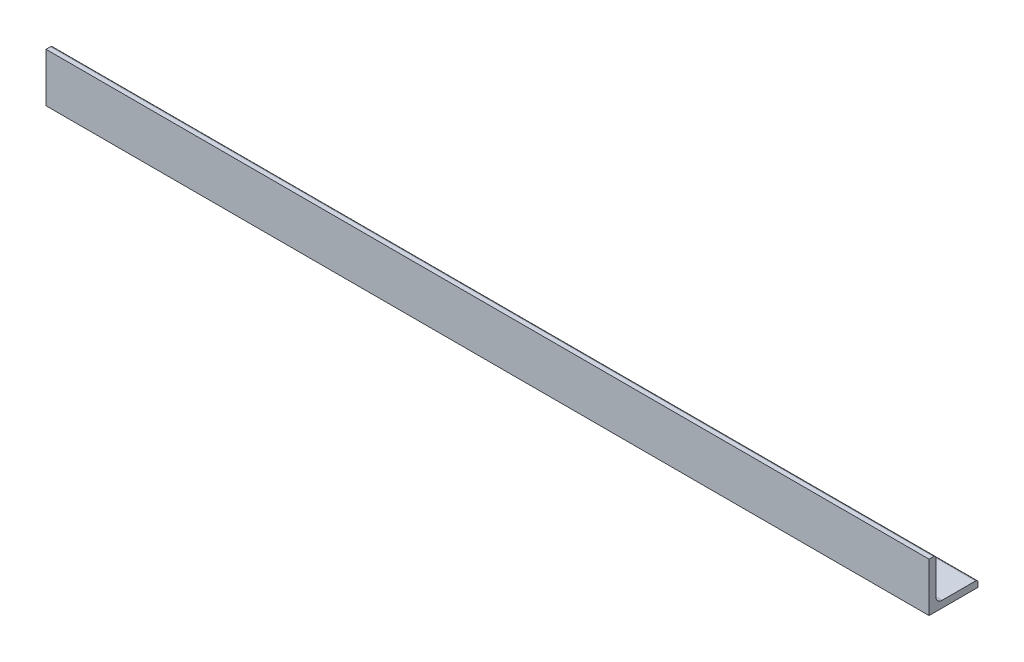
ISO-10303-21;
HEADER;
FILE_DESCRIPTION(('STEP AP214'),'2;1');
FILE_NAME('part.step','',(''),(''),'','','');
FILE_SCHEMA(('AUTOMOTIVE_DESIGN { 1 0 10303 214 1 1 1 1 }'));
ENDSEC;
DATA;
#1=APPLICATION_CONTEXT('core data for automotive mechanical design processes');
#2=APPLICATION_PROTOCOL_DEFINITION('international standard','automotive_design',2000,#1);
#3=PRODUCT_CONTEXT('',#1,'mechanical');
#4=PRODUCT('Part','Part','',(#3));
#5=PRODUCT_RELATED_PRODUCT_CATEGORY('part','',(#4));
#6=PRODUCT_DEFINITION_FORMATION('','',#4);
#7=PRODUCT_DEFINITION_CONTEXT('part definition',#1,'design');
#8=PRODUCT_DEFINITION('design','',#6,#7);
#9=PRODUCT_DEFINITION_SHAPE('','',#8);
#10=(LENGTH_UNIT() NAMED_UNIT(*) SI_UNIT(.MILLI.,.METRE.));
#11=(NAMED_UNIT(*) PLANE_ANGLE_UNIT() SI_UNIT($,.RADIAN.));
#12=(NAMED_UNIT(*) SI_UNIT($,.STERADIAN.) SOLID_ANGLE_UNIT());
#13=UNCERTAINTY_MEASURE_WITH_UNIT(LENGTH_MEASURE(1.E-05),#10,'distance_accuracy_value','');
#14=(GEOMETRIC_REPRESENTATION_CONTEXT(3) GLOBAL_UNCERTAINTY_ASSIGNED_CONTEXT((#13)) GLOBAL_UNIT_ASSIGNED_CONTEXT((#10,
#11,#12)) REPRESENTATION_CONTEXT('',''));
#15=CARTESIAN_POINT('',(0.,0.,0.));
#16=DIRECTION('',(0.,0.,1.));
#17=DIRECTION('',(1.,0.,0.));
#18=AXIS2_PLACEMENT_3D('',#15,#16,#17);
#19=CARTESIAN_POINT('',(650.,36.,0.));
#20=DIRECTION('',(0.,-1.,0.));
#21=DIRECTION('',(0.,0.,-1.));
#22=AXIS2_PLACEMENT_3D('',#19,#20,#21);
#23=PLANE('',#22);
#24=DIRECTION('',(0.,0.,1.));
#25=VECTOR('',#24,1.);
#26=CARTESIAN_POINT('',(0.,36.,0.));
#27=LINE('',#26,#25);
#28=CARTESIAN_POINT('',(0.,36.,-3.33333333333333));
#29=VERTEX_POINT('',#28);
#30=CARTESIAN_POINT('',(0.,36.,0.));
#31=VERTEX_POINT('',#30);
#32=EDGE_CURVE('E176',#29,#31,#27,.T.);
#33=ORIENTED_EDGE('',*,*,#32,.T.);
#34=DIRECTION('',(-1.,0.,0.));
#35=VECTOR('',#34,1.);
#36=CARTESIAN_POINT('',(650.,36.,0.));
#37=LINE('',#36,#35);
#38=CARTESIAN_POINT('',(650.,36.,0.));
#39=VERTEX_POINT('',#38);
#40=EDGE_CURVE('E13',#39,#31,#37,.T.);
#41=ORIENTED_EDGE('',*,*,#40,.F.);
#42=DIRECTION('',(0.,0.,1.));
#43=VECTOR('',#42,1.);
#44=CARTESIAN_POINT('',(650.,36.,0.));
#45=LINE('',#44,#43);
#46=CARTESIAN_POINT('',(650.,36.,-3.33333333333333));
#47=VERTEX_POINT('',#46);
#48=EDGE_CURVE('E201',#47,#39,#45,.T.);
#49=ORIENTED_EDGE('',*,*,#48,.F.);
#50=DIRECTION('',(-1.,0.,0.));
#51=VECTOR('',#50,1.);
#52=CARTESIAN_POINT('',(650.,36.,-3.33333333333333));
#53=LINE('',#52,#51);
#54=EDGE_CURVE('E172',#47,#29,#53,.T.);
#55=ORIENTED_EDGE('',*,*,#54,.T.);
#56=EDGE_LOOP('',(#33,#41,#49,#55));
#57=FACE_BOUND('',#56,.T.);
#58=ADVANCED_FACE('F69',(#57),#23,.F.);
#59=CARTESIAN_POINT('',(650.,36.,0.));
#60=DIRECTION('',(0.,0.,-1.));
#61=DIRECTION('',(0.,1.,0.));
#62=AXIS2_PLACEMENT_3D('',#59,#60,#61);
#63=PLANE('',#62);
#64=DIRECTION('',(0.,-1.,0.));
#65=VECTOR('',#64,1.);
#66=CARTESIAN_POINT('',(0.,36.,0.));
#67=LINE('',#66,#65);
#68=CARTESIAN_POINT('',(0.,0.,0.));
#69=VERTEX_POINT('',#68);
#70=EDGE_CURVE('E180',#31,#69,#67,.T.);
#71=ORIENTED_EDGE('',*,*,#70,.T.);
#72=DIRECTION('',(-1.,0.,0.));
#73=VECTOR('',#72,1.);
#74=CARTESIAN_POINT('',(650.,0.,0.));
#75=LINE('',#74,#73);
#76=CARTESIAN_POINT('',(650.,0.,0.));
#77=VERTEX_POINT('',#76);
#78=EDGE_CURVE('E78',#77,#69,#75,.T.);
#79=ORIENTED_EDGE('',*,*,#78,.F.);
#80=DIRECTION('',(0.,-1.,0.));
#81=VECTOR('',#80,1.);
#82=CARTESIAN_POINT('',(650.,36.,0.));
#83=LINE('',#82,#81);
#84=EDGE_CURVE('E132',#39,#77,#83,.T.);
#85=ORIENTED_EDGE('',*,*,#84,.F.);
#86=ORIENTED_EDGE('',*,*,#40,.T.);
#87=EDGE_LOOP('',(#71,#79,#85,#86));
#88=FACE_BOUND('',#87,.T.);
#89=ADVANCED_FACE('F257',(#88),#63,.F.);
#90=CARTESIAN_POINT('',(650.,0.,0.));
#91=DIRECTION('',(0.,1.,0.));
#92=DIRECTION('',(0.,0.,1.));
#93=AXIS2_PLACEMENT_3D('',#90,#91,#92);
#94=PLANE('',#93);
#95=DIRECTION('',(0.,0.,-1.));
#96=VECTOR('',#95,1.);
#97=CARTESIAN_POINT('',(0.,0.,0.));
#98=LINE('',#97,#96);
#99=CARTESIAN_POINT('',(0.,0.,-36.));
#100=VERTEX_POINT('',#99);
#101=EDGE_CURVE('E183',#69,#100,#98,.T.);
#102=ORIENTED_EDGE('',*,*,#101,.T.);
#103=DIRECTION('',(-1.,0.,0.));
#104=VECTOR('',#103,1.);
#105=CARTESIAN_POINT('',(650.,0.,-36.));
#106=LINE('',#105,#104);
#107=CARTESIAN_POINT('',(650.,0.,-36.));
#108=VERTEX_POINT('',#107);
#109=EDGE_CURVE('E216',#108,#100,#106,.T.);
#110=ORIENTED_EDGE('',*,*,#109,.F.);
#111=DIRECTION('',(0.,0.,-1.));
#112=VECTOR('',#111,1.);
#113=CARTESIAN_POINT('',(650.,0.,0.));
#114=LINE('',#113,#112);
#115=EDGE_CURVE('E226',#77,#108,#114,.T.);
#116=ORIENTED_EDGE('',*,*,#115,.F.);
#117=ORIENTED_EDGE('',*,*,#78,.T.);
#118=EDGE_LOOP('',(#102,#110,#116,#117));
#119=FACE_BOUND('',#118,.T.);
#120=ADVANCED_FACE('F224',(#119),#94,.F.);
#121=CARTESIAN_POINT('',(650.,0.,-36.));
#122=DIRECTION('',(0.,0.,1.));
#123=DIRECTION('',(0.,-1.,0.));
#124=AXIS2_PLACEMENT_3D('',#121,#122,#123);
#125=PLANE('',#124);
#126=DIRECTION('',(0.,1.,0.));
#127=VECTOR('',#126,1.);
#128=CARTESIAN_POINT('',(0.,0.,-36.));
#129=LINE('',#128,#127);
#130=CARTESIAN_POINT('',(0.,3.33333333333334,-36.));
#131=VERTEX_POINT('',#130);
#132=EDGE_CURVE('E186',#100,#131,#129,.T.);
#133=ORIENTED_EDGE('',*,*,#132,.T.);
#134=DIRECTION('',(-1.,0.,0.));
#135=VECTOR('',#134,1.);
#136=CARTESIAN_POINT('',(650.,3.33333333333334,-36.));
#137=LINE('',#136,#135);
#138=CARTESIAN_POINT('',(650.,3.33333333333334,-36.));
#139=VERTEX_POINT('',#138);
#140=EDGE_CURVE('E212',#139,#131,#137,.T.);
#141=ORIENTED_EDGE('',*,*,#140,.F.);
#142=DIRECTION('',(0.,1.,0.));
#143=VECTOR('',#142,1.);
#144=CARTESIAN_POINT('',(650.,0.,-36.));
#145=LINE('',#144,#143);
#146=EDGE_CURVE('E243',#108,#139,#145,.T.);
#147=ORIENTED_EDGE('',*,*,#146,.F.);
#148=ORIENTED_EDGE('',*,*,#109,.T.);
#149=EDGE_LOOP('',(#133,#141,#147,#148));
#150=FACE_BOUND('',#149,.T.);
#151=ADVANCED_FACE('F235',(#150),#125,.F.);
#152=CARTESIAN_POINT('',(650.,3.33333333333334,-34.3333333333333));
#153=DIRECTION('',(-1.,0.,0.));
#154=DIRECTION('',(0.,0.,1.));
#155=AXIS2_PLACEMENT_3D('',#152,#153,#154);
#156=CYLINDRICAL_SURFACE('',#155,1.66666666666666);
#157=CARTESIAN_POINT('',(0.,3.33333333333334,-34.3333333333333));
#158=DIRECTION('',(1.,0.,0.));
#159=DIRECTION('',(0.,0.,-1.));
#160=AXIS2_PLACEMENT_3D('',#157,#158,#159);
#161=CIRCLE('',#160,1.66666666666666);
#162=CARTESIAN_POINT('',(0.,5.,-34.3333333333333));
#163=VERTEX_POINT('',#162);
#164=EDGE_CURVE('E189',#131,#163,#161,.T.);
#165=ORIENTED_EDGE('',*,*,#164,.T.);
#166=DIRECTION('',(-1.,0.,0.));
#167=VECTOR('',#166,1.);
#168=CARTESIAN_POINT('',(650.,5.,-34.3333333333333));
#169=LINE('',#168,#167);
#170=CARTESIAN_POINT('',(650.,5.,-34.3333333333333));
#171=VERTEX_POINT('',#170);
#172=EDGE_CURVE('E208',#171,#163,#169,.T.);
#173=ORIENTED_EDGE('',*,*,#172,.F.);
#174=CARTESIAN_POINT('',(650.,3.33333333333334,-34.3333333333333));
#175=DIRECTION('',(1.,0.,0.));
#176=DIRECTION('',(0.,0.,-1.));
#177=AXIS2_PLACEMENT_3D('',#174,#175,#176);
#178=CIRCLE('',#177,1.66666666666666);
#179=EDGE_CURVE('E241',#139,#171,#178,.T.);
#180=ORIENTED_EDGE('',*,*,#179,.F.);
#181=ORIENTED_EDGE('',*,*,#140,.T.);
#182=EDGE_LOOP('',(#165,#173,#180,#181));
#183=FACE_BOUND('',#182,.T.);
#184=ADVANCED_FACE('F239',(#183),#156,.T.);
#185=CARTESIAN_POINT('',(650.,5.,-9.5));
#186=DIRECTION('',(0.,-1.,0.));
#187=DIRECTION('',(0.,0.,-1.));
#188=AXIS2_PLACEMENT_3D('',#185,#186,#187);
#189=PLANE('',#188);
#190=DIRECTION('',(0.,0.,1.));
#191=VECTOR('',#190,1.);
#192=CARTESIAN_POINT('',(0.,5.,-9.5));
#193=LINE('',#192,#191);
#194=CARTESIAN_POINT('',(0.,5.,-9.5));
#195=VERTEX_POINT('',#194);
#196=EDGE_CURVE('E192',#163,#195,#193,.T.);
#197=ORIENTED_EDGE('',*,*,#196,.T.);
#198=DIRECTION('',(-1.,0.,0.));
#199=VECTOR('',#198,1.);
#200=CARTESIAN_POINT('',(650.,5.,-9.5));
#201=LINE('',#200,#199);
#202=CARTESIAN_POINT('',(650.,5.,-9.5));
#203=VERTEX_POINT('',#202);
#204=EDGE_CURVE('E165',#203,#195,#201,.T.);
#205=ORIENTED_EDGE('',*,*,#204,.F.);
#206=DIRECTION('',(0.,0.,1.));
#207=VECTOR('',#206,1.);
#208=CARTESIAN_POINT('',(650.,5.,-9.5));
#209=LINE('',#208,#207);
#210=EDGE_CURVE('E154',#171,#203,#209,.T.);
#211=ORIENTED_EDGE('',*,*,#210,.F.);
#212=ORIENTED_EDGE('',*,*,#172,.T.);
#213=EDGE_LOOP('',(#197,#205,#211,#212));
#214=FACE_BOUND('',#213,.T.);
#215=ADVANCED_FACE('F269',(#214),#189,.F.);
#216=CARTESIAN_POINT('',(650.,9.5,-9.5));
#217=DIRECTION('',(-1.,0.,0.));
#218=DIRECTION('',(0.,0.,1.));
#219=AXIS2_PLACEMENT_3D('',#216,#217,#218);
#220=CYLINDRICAL_SURFACE('',#219,4.5);
#221=CARTESIAN_POINT('',(0.,9.5,-9.5));
#222=DIRECTION('',(-1.,0.,0.));
#223=DIRECTION('',(0.,0.,-1.));
#224=AXIS2_PLACEMENT_3D('',#221,#222,#223);
#225=CIRCLE('',#224,4.5);
#226=CARTESIAN_POINT('',(0.,9.5,-5.));
#227=VERTEX_POINT('',#226);
#228=EDGE_CURVE('E163',#195,#227,#225,.T.);
#229=ORIENTED_EDGE('',*,*,#228,.T.);
#230=DIRECTION('',(-1.,0.,0.));
#231=VECTOR('',#230,1.);
#232=CARTESIAN_POINT('',(650.,9.5,-5.));
#233=LINE('',#232,#231);
#234=CARTESIAN_POINT('',(650.,9.5,-5.));
#235=VERTEX_POINT('',#234);
#236=EDGE_CURVE('E160',#235,#227,#233,.T.);
#237=ORIENTED_EDGE('',*,*,#236,.F.);
#238=CARTESIAN_POINT('',(650.,9.5,-9.5));
#239=DIRECTION('',(-1.,0.,0.));
#240=DIRECTION('',(0.,0.,-1.));
#241=AXIS2_PLACEMENT_3D('',#238,#239,#240);
#242=CIRCLE('',#241,4.5);
#243=EDGE_CURVE('E148',#203,#235,#242,.T.);
#244=ORIENTED_EDGE('',*,*,#243,.F.);
#245=ORIENTED_EDGE('',*,*,#204,.T.);
#246=EDGE_LOOP('',(#229,#237,#244,#245));
#247=FACE_BOUND('',#246,.T.);
#248=ADVANCED_FACE('F161',(#247),#220,.F.);
#249=CARTESIAN_POINT('',(650.,34.3333333333333,-5.));
#250=DIRECTION('',(0.,0.,1.));
#251=DIRECTION('',(0.,-1.,0.));
#252=AXIS2_PLACEMENT_3D('',#249,#250,#251);
#253=PLANE('',#252);
#254=DIRECTION('',(0.,1.,0.));
#255=VECTOR('',#254,1.);
#256=CARTESIAN_POINT('',(0.,34.3333333333333,-5.));
#257=LINE('',#256,#255);
#258=CARTESIAN_POINT('',(0.,34.3333333333333,-5.));
#259=VERTEX_POINT('',#258);
#260=EDGE_CURVE('E118',#227,#259,#257,.T.);
#261=ORIENTED_EDGE('',*,*,#260,.T.);
#262=DIRECTION('',(-1.,0.,0.));
#263=VECTOR('',#262,1.);
#264=CARTESIAN_POINT('',(650.,34.3333333333333,-5.));
#265=LINE('',#264,#263);
#266=CARTESIAN_POINT('',(650.,34.3333333333333,-5.));
#267=VERTEX_POINT('',#266);
#268=EDGE_CURVE('E166',#267,#259,#265,.T.);
#269=ORIENTED_EDGE('',*,*,#268,.F.);
#270=DIRECTION('',(0.,1.,0.));
#271=VECTOR('',#270,1.);
#272=CARTESIAN_POINT('',(650.,34.3333333333333,-5.));
#273=LINE('',#272,#271);
#274=EDGE_CURVE('E152',#235,#267,#273,.T.);
#275=ORIENTED_EDGE('',*,*,#274,.F.);
#276=ORIENTED_EDGE('',*,*,#236,.T.);
#277=EDGE_LOOP('',(#261,#269,#275,#276));
#278=FACE_BOUND('',#277,.T.);
#279=ADVANCED_FACE('F168',(#278),#253,.F.);
#280=CARTESIAN_POINT('',(650.,34.3333333333333,-3.33333333333333));
#281=DIRECTION('',(-1.,0.,0.));
#282=DIRECTION('',(0.,0.,1.));
#283=AXIS2_PLACEMENT_3D('',#280,#281,#282);
#284=CYLINDRICAL_SURFACE('',#283,1.66666666666666);
#285=CARTESIAN_POINT('',(0.,34.3333333333333,-3.33333333333333));
#286=DIRECTION('',(1.,0.,0.));
#287=DIRECTION('',(0.,0.,1.));
#288=AXIS2_PLACEMENT_3D('',#285,#286,#287);
#289=CIRCLE('',#288,1.66666666666666);
#290=EDGE_CURVE('E124',#259,#29,#289,.T.);
#291=ORIENTED_EDGE('',*,*,#290,.T.);
#292=ORIENTED_EDGE('',*,*,#54,.F.);
#293=CARTESIAN_POINT('',(650.,34.3333333333333,-3.33333333333333));
#294=DIRECTION('',(1.,0.,0.));
#295=DIRECTION('',(0.,0.,1.));
#296=AXIS2_PLACEMENT_3D('',#293,#294,#295);
#297=CIRCLE('',#296,1.66666666666666);
#298=EDGE_CURVE('E86',#267,#47,#297,.T.);
#299=ORIENTED_EDGE('',*,*,#298,.F.);
#300=ORIENTED_EDGE('',*,*,#268,.T.);
#301=EDGE_LOOP('',(#291,#292,#299,#300));
#302=FACE_BOUND('',#301,.T.);
#303=ADVANCED_FACE('F277',(#302),#284,.T.);
#304=CARTESIAN_POINT('',(650.,34.3333333333333,-3.33333333333333));
#305=DIRECTION('',(-1.,0.,0.));
#306=DIRECTION('',(0.,0.,1.));
#307=AXIS2_PLACEMENT_3D('',#304,#305,#306);
#308=PLANE('',#307);
#309=ORIENTED_EDGE('',*,*,#48,.T.);
#310=ORIENTED_EDGE('',*,*,#84,.T.);
#311=ORIENTED_EDGE('',*,*,#115,.T.);
#312=ORIENTED_EDGE('',*,*,#146,.T.);
#313=ORIENTED_EDGE('',*,*,#179,.T.);
#314=ORIENTED_EDGE('',*,*,#210,.T.);
#315=ORIENTED_EDGE('',*,*,#243,.T.);
#316=ORIENTED_EDGE('',*,*,#274,.T.);
#317=ORIENTED_EDGE('',*,*,#298,.T.);
#318=EDGE_LOOP('',(#309,#310,#311,#312,#313,#314,#315,#316,#317));
#319=FACE_BOUND('',#318,.T.);
#320=ADVANCED_FACE('F150',(#319),#308,.F.);
#321=CARTESIAN_POINT('',(0.,34.3333333333333,-3.33333333333333));
#322=DIRECTION('',(-1.,0.,0.));
#323=DIRECTION('',(0.,0.,1.));
#324=AXIS2_PLACEMENT_3D('',#321,#322,#323);
#325=PLANE('',#324);
#326=ORIENTED_EDGE('',*,*,#32,.F.);
#327=ORIENTED_EDGE('',*,*,#290,.F.);
#328=ORIENTED_EDGE('',*,*,#260,.F.);
#329=ORIENTED_EDGE('',*,*,#228,.F.);
#330=ORIENTED_EDGE('',*,*,#196,.F.);
#331=ORIENTED_EDGE('',*,*,#164,.F.);
#332=ORIENTED_EDGE('',*,*,#132,.F.);
#333=ORIENTED_EDGE('',*,*,#101,.F.);
#334=ORIENTED_EDGE('',*,*,#70,.F.);
#335=EDGE_LOOP('',(#326,#327,#328,#329,#330,#331,#332,#333,#334));
#336=FACE_BOUND('',#335,.T.);
#337=ADVANCED_FACE('F230',(#336),#325,.T.);
#338=CLOSED_SHELL('',(#58,#89,#120,#151,#184,#215,#248,#279,#303,#320,#337));
#339=MANIFOLD_SOLID_BREP('B2',#338);
#340=ADVANCED_BREP_SHAPE_REPRESENTATION('',(#18,#339),#14);
#341=SHAPE_DEFINITION_REPRESENTATION(#9,#340);
ENDSEC;
END-ISO-10303-21;
